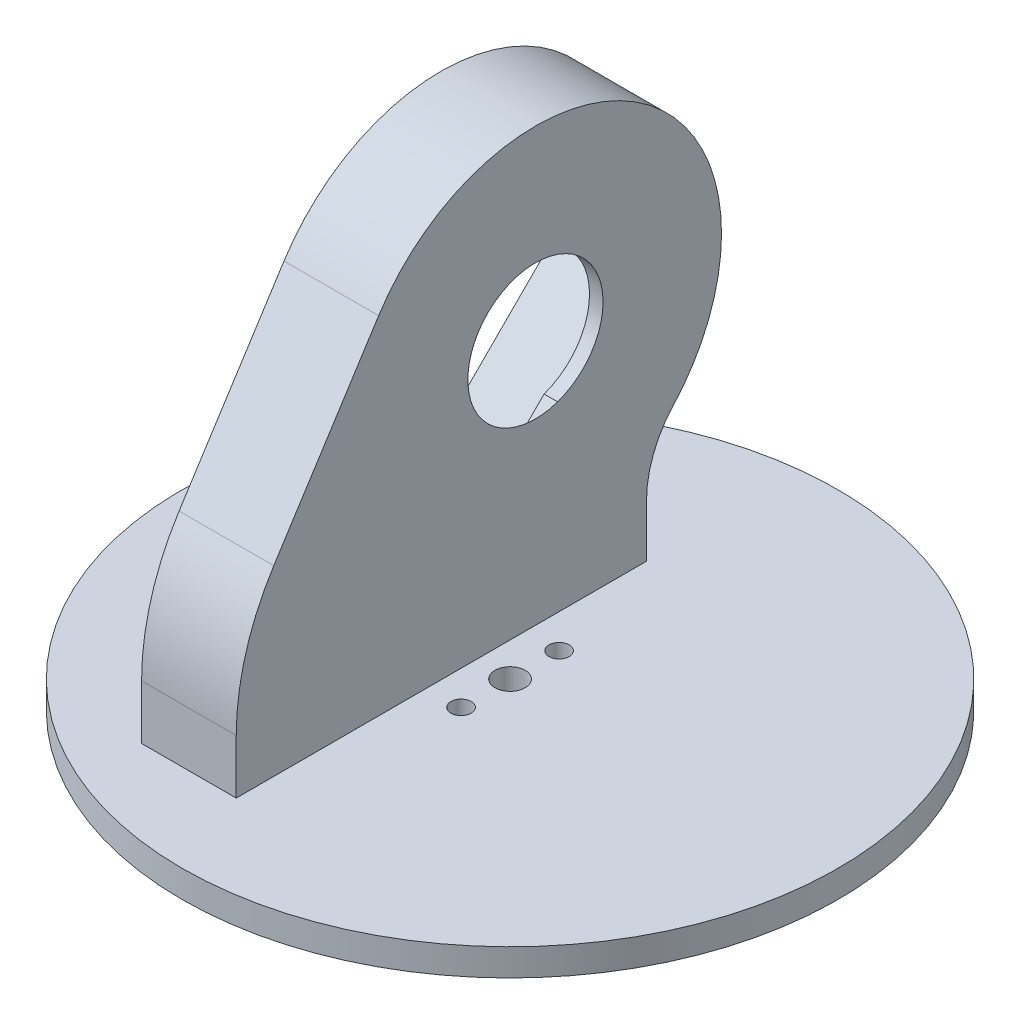
ISO-10303-21;
HEADER;
FILE_DESCRIPTION(('STEP AP214'),'2;1');
FILE_NAME('part.step','',(''),(''),'','','');
FILE_SCHEMA(('AUTOMOTIVE_DESIGN { 1 0 10303 214 1 1 1 1 }'));
ENDSEC;
DATA;
#1=APPLICATION_CONTEXT('core data for automotive mechanical design processes');
#2=APPLICATION_PROTOCOL_DEFINITION('international standard','automotive_design',2000,#1);
#3=PRODUCT_CONTEXT('',#1,'mechanical');
#4=PRODUCT('Part','Part','',(#3));
#5=PRODUCT_RELATED_PRODUCT_CATEGORY('part','',(#4));
#6=PRODUCT_DEFINITION_FORMATION('','',#4);
#7=PRODUCT_DEFINITION_CONTEXT('part definition',#1,'design');
#8=PRODUCT_DEFINITION('design','',#6,#7);
#9=PRODUCT_DEFINITION_SHAPE('','',#8);
#10=(LENGTH_UNIT() NAMED_UNIT(*) SI_UNIT(.MILLI.,.METRE.));
#11=(NAMED_UNIT(*) PLANE_ANGLE_UNIT() SI_UNIT($,.RADIAN.));
#12=(NAMED_UNIT(*) SI_UNIT($,.STERADIAN.) SOLID_ANGLE_UNIT());
#13=UNCERTAINTY_MEASURE_WITH_UNIT(LENGTH_MEASURE(1.E-05),#10,'distance_accuracy_value','');
#14=(GEOMETRIC_REPRESENTATION_CONTEXT(3) GLOBAL_UNCERTAINTY_ASSIGNED_CONTEXT((#13)) GLOBAL_UNIT_ASSIGNED_CONTEXT((#10,
#11,#12)) REPRESENTATION_CONTEXT('',''));
#15=CARTESIAN_POINT('',(0.,0.,0.));
#16=DIRECTION('',(0.,0.,1.));
#17=DIRECTION('',(1.,0.,0.));
#18=AXIS2_PLACEMENT_3D('',#15,#16,#17);
#19=CARTESIAN_POINT('',(-19.,40.4372610697106,-8.74999999999998));
#20=DIRECTION('',(1.,0.,0.));
#21=DIRECTION('',(0.,0.,-1.));
#22=AXIS2_PLACEMENT_3D('',#19,#20,#21);
#23=CYLINDRICAL_SURFACE('',#22,10.);
#24=CARTESIAN_POINT('',(-4.9999,40.4372610697106,-8.74999999999998));
#25=DIRECTION('',(1.,0.,0.));
#26=DIRECTION('',(0.,0.,-1.));
#27=AXIS2_PLACEMENT_3D('',#24,#25,#26);
#28=CIRCLE('',#27,10.);
#29=CARTESIAN_POINT('',(-4.9999,40.4372610697106,-18.75));
#30=VERTEX_POINT('',#29);
#31=EDGE_CURVE('E382',#30,#30,#28,.T.);
#32=ORIENTED_EDGE('',*,*,#31,.T.);
#33=EDGE_LOOP('',(#32));
#34=FACE_BOUND('',#33,.T.);
#35=DIRECTION('',(-1.,0.,0.));
#36=VECTOR('',#35,1.);
#37=CARTESIAN_POINT('',(-5.,43.7190150989049,0.696168032163472));
#38=LINE('',#37,#36);
#39=CARTESIAN_POINT('',(-5.,43.7190150989049,0.696168032163472));
#40=VERTEX_POINT('',#39);
#41=CARTESIAN_POINT('',(-7.,43.7190150989049,0.696168032163472));
#42=VERTEX_POINT('',#41);
#43=EDGE_CURVE('E718',#40,#42,#38,.T.);
#44=ORIENTED_EDGE('',*,*,#43,.T.);
#45=CARTESIAN_POINT('',(-7.,40.4372610697106,-8.74999999999998));
#46=DIRECTION('',(1.,0.,0.));
#47=DIRECTION('',(0.,0.,-1.));
#48=AXIS2_PLACEMENT_3D('',#45,#46,#47);
#49=CIRCLE('',#48,10.);
#50=CARTESIAN_POINT('',(-7.,30.9910930375471,-12.0317540291943));
#51=VERTEX_POINT('',#50);
#52=EDGE_CURVE('E201',#42,#51,#49,.F.);
#53=ORIENTED_EDGE('',*,*,#52,.T.);
#54=DIRECTION('',(-1.,0.,0.));
#55=VECTOR('',#54,1.);
#56=CARTESIAN_POINT('',(-5.,30.9910930375471,-12.0317540291943));
#57=LINE('',#56,#55);
#58=CARTESIAN_POINT('',(-5.,30.9910930375471,-12.0317540291943));
#59=VERTEX_POINT('',#58);
#60=EDGE_CURVE('E63',#59,#51,#57,.T.);
#61=ORIENTED_EDGE('',*,*,#60,.F.);
#62=CARTESIAN_POINT('',(-5.,40.4372610697106,-8.74999999999998));
#63=DIRECTION('',(-1.,0.,0.));
#64=DIRECTION('',(0.,0.,1.));
#65=AXIS2_PLACEMENT_3D('',#62,#63,#64);
#66=CIRCLE('',#65,10.);
#67=EDGE_CURVE('E187',#40,#59,#66,.F.);
#68=ORIENTED_EDGE('',*,*,#67,.F.);
#69=EDGE_LOOP('',(#44,#53,#61,#68));
#70=FACE_BOUND('',#69,.T.);
#71=ADVANCED_FACE('F45',(#34,#70),#23,.F.);
#72=CARTESIAN_POINT('',(-7.,0.,0.));
#73=DIRECTION('',(1.,0.,0.));
#74=DIRECTION('',(0.,0.,-1.));
#75=AXIS2_PLACEMENT_3D('',#72,#73,#74);
#76=PLANE('',#75);
#77=DIRECTION('',(0.,-0.707106781186547,0.707106781186548));
#78=VECTOR('',#77,1.);
#79=CARTESIAN_POINT('',(-7.,11.2691063457655,5.56891231902761));
#80=LINE('',#79,#78);
#81=CARTESIAN_POINT('',(-7.,40.2604843744139,-23.4224657096208));
#82=VERTEX_POINT('',#81);
#83=CARTESIAN_POINT('',(-7.,11.2691063457655,5.56891231902761));
#84=VERTEX_POINT('',#83);
#85=EDGE_CURVE('E543',#82,#84,#80,.T.);
#86=ORIENTED_EDGE('',*,*,#85,.T.);
#87=DIRECTION('',(0.,0.707106781186548,0.707106781186547));
#88=VECTOR('',#87,1.);
#89=CARTESIAN_POINT('',(-7.,11.2691063457655,5.56891231902761));
#90=LINE('',#89,#88);
#91=CARTESIAN_POINT('',(-7.,26.1183487506831,20.4181547239452));
#92=VERTEX_POINT('',#91);
#93=EDGE_CURVE('E558',#84,#92,#90,.T.);
#94=ORIENTED_EDGE('',*,*,#93,.T.);
#95=DIRECTION('',(0.,0.707106781186547,-0.707106781186548));
#96=VECTOR('',#95,1.);
#97=CARTESIAN_POINT('',(-7.,26.1183487506831,20.4181547239452));
#98=LINE('',#97,#96);
#99=CARTESIAN_POINT('',(-7.,55.1097267793315,-8.57322330470323));
#100=VERTEX_POINT('',#99);
#101=EDGE_CURVE('E561',#92,#100,#98,.T.);
#102=ORIENTED_EDGE('',*,*,#101,.T.);
#103=DIRECTION('',(0.,-0.707106781186548,-0.707106781186547));
#104=VECTOR('',#103,1.);
#105=CARTESIAN_POINT('',(-7.,40.2604843744139,-23.4224657096208));
#106=LINE('',#105,#104);
#107=EDGE_CURVE('E399',#100,#82,#106,.T.);
#108=ORIENTED_EDGE('',*,*,#107,.T.);
#109=EDGE_LOOP('',(#86,#94,#102,#108));
#110=FACE_BOUND('',#109,.T.);
#111=DIRECTION('',(0.,-0.707106781186548,0.707106781186548));
#112=VECTOR('',#111,1.);
#113=CARTESIAN_POINT('',(-7.,22.2075915655342,22.2075915655342));
#114=LINE('',#113,#112);
#115=CARTESIAN_POINT('',(-7.,29.1942632488444,15.2209198822239));
#116=VERTEX_POINT('',#115);
#117=EDGE_CURVE('E197',#42,#116,#114,.T.);
#118=ORIENTED_EDGE('',*,*,#117,.T.);
#119=DIRECTION('',(0.,0.707106781186547,0.707106781186548));
#120=VECTOR('',#119,1.);
#121=CARTESIAN_POINT('',(-7.,6.98667168331025,-6.98667168331024));
#122=LINE('',#121,#120);
#123=CARTESIAN_POINT('',(-7.,25.7011557497829,11.7278123831624));
#124=VERTEX_POINT('',#123);
#125=EDGE_CURVE('E709',#124,#116,#122,.T.);
#126=ORIENTED_EDGE('',*,*,#125,.F.);
#127=CARTESIAN_POINT('',(-7.,22.8303022181655,8.85695885154502));
#128=DIRECTION('',(-1.,0.,0.));
#129=DIRECTION('',(0.,0.,1.));
#130=AXIS2_PLACEMENT_3D('',#127,#128,#129);
#131=CIRCLE('',#130,4.06);
#132=CARTESIAN_POINT('',(-7.,19.9594486865481,5.98610531992763));
#133=VERTEX_POINT('',#132);
#134=EDGE_CURVE('E702',#133,#124,#131,.T.);
#135=ORIENTED_EDGE('',*,*,#134,.F.);
#136=DIRECTION('',(0.,0.707106781186547,0.707106781186548));
#137=VECTOR('',#136,1.);
#138=CARTESIAN_POINT('',(-7.,6.98667168331025,-6.98667168331024));
#139=LINE('',#138,#137);
#140=CARTESIAN_POINT('',(-7.,16.4663411874866,2.49299782086615));
#141=VERTEX_POINT('',#140);
#142=EDGE_CURVE('E698',#141,#133,#139,.T.);
#143=ORIENTED_EDGE('',*,*,#142,.F.);
#144=DIRECTION('',(0.,-0.707106781186548,0.707106781186547));
#145=VECTOR('',#144,1.);
#146=CARTESIAN_POINT('',(-7.,9.47966950417638,9.4796695041764));
#147=LINE('',#146,#145);
#148=EDGE_CURVE('E703',#51,#141,#147,.T.);
#149=ORIENTED_EDGE('',*,*,#148,.F.);
#150=ORIENTED_EDGE('',*,*,#52,.F.);
#151=EDGE_LOOP('',(#118,#126,#135,#143,#149,#150));
#152=FACE_BOUND('',#151,.T.);
#153=ADVANCED_FACE('F264',(#110,#152),#76,.F.);
#154=CARTESIAN_POINT('',(0.,4.,0.));
#155=DIRECTION('',(0.,1.,0.));
#156=DIRECTION('',(0.,0.,1.));
#157=AXIS2_PLACEMENT_3D('',#154,#155,#156);
#158=PLANE('',#157);
#159=CARTESIAN_POINT('',(0.,4.,7.25));
#160=DIRECTION('',(0.,1.,0.));
#161=DIRECTION('',(0.,0.,1.));
#162=AXIS2_PLACEMENT_3D('',#159,#160,#161);
#163=CIRCLE('',#162,1.5);
#164=CARTESIAN_POINT('',(0.,4.,8.75));
#165=VERTEX_POINT('',#164);
#166=EDGE_CURVE('E368',#165,#165,#163,.T.);
#167=ORIENTED_EDGE('',*,*,#166,.F.);
#168=EDGE_LOOP('',(#167));
#169=FACE_BOUND('',#168,.T.);
#170=CARTESIAN_POINT('',(0.,4.,0.));
#171=DIRECTION('',(0.,1.,0.));
#172=DIRECTION('',(0.,0.,1.));
#173=AXIS2_PLACEMENT_3D('',#170,#171,#172);
#174=CIRCLE('',#173,48.5);
#175=CARTESIAN_POINT('',(0.,4.,48.5));
#176=VERTEX_POINT('',#175);
#177=EDGE_CURVE('E11',#176,#176,#174,.T.);
#178=ORIENTED_EDGE('',*,*,#177,.T.);
#179=EDGE_LOOP('',(#178));
#180=FACE_BOUND('',#179,.T.);
#181=CARTESIAN_POINT('',(0.,4.,-7.25));
#182=DIRECTION('',(0.,1.,0.));
#183=DIRECTION('',(0.,0.,1.));
#184=AXIS2_PLACEMENT_3D('',#181,#182,#183);
#185=CIRCLE('',#184,1.5);
#186=CARTESIAN_POINT('',(0.,4.,-5.75));
#187=VERTEX_POINT('',#186);
#188=EDGE_CURVE('E374',#187,#187,#185,.T.);
#189=ORIENTED_EDGE('',*,*,#188,.F.);
#190=EDGE_LOOP('',(#189));
#191=FACE_BOUND('',#190,.T.);
#192=CARTESIAN_POINT('',(0.,4.,0.));
#193=DIRECTION('',(0.,1.,0.));
#194=DIRECTION('',(0.,0.,1.));
#195=AXIS2_PLACEMENT_3D('',#192,#193,#194);
#196=CIRCLE('',#195,2.23559103478263);
#197=CARTESIAN_POINT('',(0.,4.,2.23559103478263));
#198=VERTEX_POINT('',#197);
#199=EDGE_CURVE('E357',#198,#198,#196,.T.);
#200=ORIENTED_EDGE('',*,*,#199,.F.);
#201=EDGE_LOOP('',(#200));
#202=FACE_BOUND('',#201,.T.);
#203=DIRECTION('',(0.,0.,-1.));
#204=VECTOR('',#203,1.);
#205=CARTESIAN_POINT('',(-19.,4.,-25.18));
#206=LINE('',#205,#204);
#207=CARTESIAN_POINT('',(-19.,3.99999999999999,35.5));
#208=VERTEX_POINT('',#207);
#209=CARTESIAN_POINT('',(-19.,3.99999999999999,28.7375200818037));
#210=VERTEX_POINT('',#209);
#211=EDGE_CURVE('E440',#208,#210,#206,.T.);
#212=ORIENTED_EDGE('',*,*,#211,.T.);
#213=DIRECTION('',(-1.,0.,0.));
#214=VECTOR('',#213,1.);
#215=CARTESIAN_POINT('',(-17.,3.99999999999999,28.7375200818037));
#216=LINE('',#215,#214);
#217=CARTESIAN_POINT('',(-17.,3.99999999999999,28.7375200818037));
#218=VERTEX_POINT('',#217);
#219=EDGE_CURVE('E499',#218,#210,#216,.T.);
#220=ORIENTED_EDGE('',*,*,#219,.F.);
#221=DIRECTION('',(0.,0.,1.));
#222=VECTOR('',#221,1.);
#223=CARTESIAN_POINT('',(-17.,4.,-16.8750750838362));
#224=LINE('',#223,#222);
#225=CARTESIAN_POINT('',(-17.,4.,-16.8750750838362));
#226=VERTEX_POINT('',#225);
#227=EDGE_CURVE('E219',#226,#218,#224,.T.);
#228=ORIENTED_EDGE('',*,*,#227,.F.);
#229=DIRECTION('',(-1.,0.,0.));
#230=VECTOR('',#229,1.);
#231=CARTESIAN_POINT('',(-17.,4.,-16.8750750838362));
#232=LINE('',#231,#230);
#233=CARTESIAN_POINT('',(-19.,4.,-16.8750750838362));
#234=VERTEX_POINT('',#233);
#235=EDGE_CURVE('E503',#226,#234,#232,.T.);
#236=ORIENTED_EDGE('',*,*,#235,.T.);
#237=CARTESIAN_POINT('',(-19.,4.,-25.18));
#238=VERTEX_POINT('',#237);
#239=EDGE_CURVE('E439',#234,#238,#206,.T.);
#240=ORIENTED_EDGE('',*,*,#239,.T.);
#241=DIRECTION('',(1.,0.,0.));
#242=VECTOR('',#241,1.);
#243=CARTESIAN_POINT('',(-19.,4.,-25.18));
#244=LINE('',#243,#242);
#245=CARTESIAN_POINT('',(-4.9999,4.,-25.18));
#246=VERTEX_POINT('',#245);
#247=EDGE_CURVE('E476',#238,#246,#244,.T.);
#248=ORIENTED_EDGE('',*,*,#247,.T.);
#249=DIRECTION('',(0.,0.,-1.));
#250=VECTOR('',#249,1.);
#251=CARTESIAN_POINT('',(-4.9999,4.,-25.18));
#252=LINE('',#251,#250);
#253=CARTESIAN_POINT('',(-4.9999,3.99999999999999,35.5));
#254=VERTEX_POINT('',#253);
#255=EDGE_CURVE('E412',#254,#246,#252,.T.);
#256=ORIENTED_EDGE('',*,*,#255,.F.);
#257=DIRECTION('',(1.,0.,0.));
#258=VECTOR('',#257,1.);
#259=CARTESIAN_POINT('',(-19.,3.99999999999999,35.5));
#260=LINE('',#259,#258);
#261=EDGE_CURVE('E463',#208,#254,#260,.T.);
#262=ORIENTED_EDGE('',*,*,#261,.F.);
#263=EDGE_LOOP('',(#212,#220,#228,#236,#240,#248,#256,#262));
#264=FACE_BOUND('',#263,.T.);
#265=ADVANCED_FACE('F267',(#169,#180,#191,#202,#264),#158,.T.);
#266=CARTESIAN_POINT('',(0.,0.,0.));
#267=DIRECTION('',(0.,1.,0.));
#268=DIRECTION('',(0.,0.,1.));
#269=AXIS2_PLACEMENT_3D('',#266,#267,#268);
#270=PLANE('',#269);
#271=CARTESIAN_POINT('',(0.,0.,0.));
#272=DIRECTION('',(0.,1.,0.));
#273=DIRECTION('',(0.,0.,1.));
#274=AXIS2_PLACEMENT_3D('',#271,#272,#273);
#275=CIRCLE('',#274,48.5);
#276=CARTESIAN_POINT('',(0.,0.,48.5));
#277=VERTEX_POINT('',#276);
#278=EDGE_CURVE('E55',#277,#277,#275,.T.);
#279=ORIENTED_EDGE('',*,*,#278,.F.);
#280=EDGE_LOOP('',(#279));
#281=FACE_BOUND('',#280,.T.);
#282=CARTESIAN_POINT('',(0.,0.,-7.25));
#283=DIRECTION('',(0.,1.,0.));
#284=DIRECTION('',(0.,0.,1.));
#285=AXIS2_PLACEMENT_3D('',#282,#283,#284);
#286=CIRCLE('',#285,1.5);
#287=CARTESIAN_POINT('',(0.,0.,-5.75));
#288=VERTEX_POINT('',#287);
#289=EDGE_CURVE('E347',#288,#288,#286,.T.);
#290=ORIENTED_EDGE('',*,*,#289,.T.);
#291=EDGE_LOOP('',(#290));
#292=FACE_BOUND('',#291,.T.);
#293=CARTESIAN_POINT('',(0.,0.,7.25));
#294=DIRECTION('',(0.,1.,0.));
#295=DIRECTION('',(0.,0.,1.));
#296=AXIS2_PLACEMENT_3D('',#293,#294,#295);
#297=CIRCLE('',#296,1.5);
#298=CARTESIAN_POINT('',(0.,0.,8.75));
#299=VERTEX_POINT('',#298);
#300=EDGE_CURVE('E351',#299,#299,#297,.T.);
#301=ORIENTED_EDGE('',*,*,#300,.T.);
#302=EDGE_LOOP('',(#301));
#303=FACE_BOUND('',#302,.T.);
#304=CARTESIAN_POINT('',(0.,0.,0.));
#305=DIRECTION('',(0.,1.,0.));
#306=DIRECTION('',(0.,0.,1.));
#307=AXIS2_PLACEMENT_3D('',#304,#305,#306);
#308=CIRCLE('',#307,2.23559103478263);
#309=CARTESIAN_POINT('',(0.,0.,2.23559103478263));
#310=VERTEX_POINT('',#309);
#311=EDGE_CURVE('E354',#310,#310,#308,.T.);
#312=ORIENTED_EDGE('',*,*,#311,.T.);
#313=EDGE_LOOP('',(#312));
#314=FACE_BOUND('',#313,.T.);
#315=ADVANCED_FACE('F333',(#281,#292,#303,#314),#270,.F.);
#316=CARTESIAN_POINT('',(0.,4.,0.));
#317=DIRECTION('',(0.,-1.,0.));
#318=DIRECTION('',(0.,0.,-1.));
#319=AXIS2_PLACEMENT_3D('',#316,#317,#318);
#320=CYLINDRICAL_SURFACE('',#319,48.5);
#321=ORIENTED_EDGE('',*,*,#177,.F.);
#322=EDGE_LOOP('',(#321));
#323=FACE_BOUND('',#322,.T.);
#324=ORIENTED_EDGE('',*,*,#278,.T.);
#325=EDGE_LOOP('',(#324));
#326=FACE_BOUND('',#325,.T.);
#327=ADVANCED_FACE('F47',(#323,#326),#320,.T.);
#328=CARTESIAN_POINT('',(0.,4.,-7.25));
#329=DIRECTION('',(0.,-1.,0.));
#330=DIRECTION('',(0.,0.,-1.));
#331=AXIS2_PLACEMENT_3D('',#328,#329,#330);
#332=CYLINDRICAL_SURFACE('',#331,1.5);
#333=ORIENTED_EDGE('',*,*,#188,.T.);
#334=EDGE_LOOP('',(#333));
#335=FACE_BOUND('',#334,.T.);
#336=ORIENTED_EDGE('',*,*,#289,.F.);
#337=EDGE_LOOP('',(#336));
#338=FACE_BOUND('',#337,.T.);
#339=ADVANCED_FACE('F327',(#335,#338),#332,.F.);
#340=CARTESIAN_POINT('',(0.,4.,7.25));
#341=DIRECTION('',(0.,-1.,0.));
#342=DIRECTION('',(0.,0.,-1.));
#343=AXIS2_PLACEMENT_3D('',#340,#341,#342);
#344=CYLINDRICAL_SURFACE('',#343,1.5);
#345=ORIENTED_EDGE('',*,*,#166,.T.);
#346=EDGE_LOOP('',(#345));
#347=FACE_BOUND('',#346,.T.);
#348=ORIENTED_EDGE('',*,*,#300,.F.);
#349=EDGE_LOOP('',(#348));
#350=FACE_BOUND('',#349,.T.);
#351=ADVANCED_FACE('F323',(#347,#350),#344,.F.);
#352=CARTESIAN_POINT('',(0.,4.,0.));
#353=DIRECTION('',(0.,-1.,0.));
#354=DIRECTION('',(0.,0.,-1.));
#355=AXIS2_PLACEMENT_3D('',#352,#353,#354);
#356=CYLINDRICAL_SURFACE('',#355,2.23559103478263);
#357=ORIENTED_EDGE('',*,*,#199,.T.);
#358=EDGE_LOOP('',(#357));
#359=FACE_BOUND('',#358,.T.);
#360=ORIENTED_EDGE('',*,*,#311,.F.);
#361=EDGE_LOOP('',(#360));
#362=FACE_BOUND('',#361,.T.);
#363=ADVANCED_FACE('F319',(#359,#362),#356,.F.);
#364=CARTESIAN_POINT('',(-19.,3.99999999999999,35.5));
#365=DIRECTION('',(0.,0.,1.));
#366=DIRECTION('',(1.,0.,0.));
#367=AXIS2_PLACEMENT_3D('',#364,#365,#366);
#368=PLANE('',#367);
#369=ORIENTED_EDGE('',*,*,#261,.T.);
#370=DIRECTION('',(0.,-1.,0.));
#371=VECTOR('',#370,1.);
#372=CARTESIAN_POINT('',(-4.9999,3.99999999999999,35.5));
#373=LINE('',#372,#371);
#374=CARTESIAN_POINT('',(-4.9999,12.0172610697105,35.5));
#375=VERTEX_POINT('',#374);
#376=EDGE_CURVE('E387',#375,#254,#373,.T.);
#377=ORIENTED_EDGE('',*,*,#376,.F.);
#378=DIRECTION('',(1.,0.,0.));
#379=VECTOR('',#378,1.);
#380=CARTESIAN_POINT('',(-19.,12.0172610697105,35.5));
#381=LINE('',#380,#379);
#382=CARTESIAN_POINT('',(-19.,12.0172610697105,35.5));
#383=VERTEX_POINT('',#382);
#384=EDGE_CURVE('E358',#383,#375,#381,.T.);
#385=ORIENTED_EDGE('',*,*,#384,.F.);
#386=DIRECTION('',(0.,-1.,0.));
#387=VECTOR('',#386,1.);
#388=CARTESIAN_POINT('',(-19.,3.99999999999999,35.5));
#389=LINE('',#388,#387);
#390=EDGE_CURVE('E435',#383,#208,#389,.T.);
#391=ORIENTED_EDGE('',*,*,#390,.T.);
#392=EDGE_LOOP('',(#369,#377,#385,#391));
#393=FACE_BOUND('',#392,.T.);
#394=ADVANCED_FACE('F301',(#393),#368,.T.);
#395=CARTESIAN_POINT('',(-19.,12.0172610697105,0.27000000000001));
#396=DIRECTION('',(1.,0.,0.));
#397=DIRECTION('',(0.,0.,-1.));
#398=AXIS2_PLACEMENT_3D('',#395,#396,#397);
#399=CYLINDRICAL_SURFACE('',#398,35.23);
#400=ORIENTED_EDGE('',*,*,#384,.T.);
#401=CARTESIAN_POINT('',(-4.9999,12.0172610697105,0.27000000000001));
#402=DIRECTION('',(1.,0.,0.));
#403=DIRECTION('',(0.,0.,1.));
#404=AXIS2_PLACEMENT_3D('',#401,#402,#403);
#405=CIRCLE('',#404,35.23);
#406=CARTESIAN_POINT('',(-4.9999,30.9933747980184,29.9526549986743));
#407=VERTEX_POINT('',#406);
#408=EDGE_CURVE('E431',#407,#375,#405,.T.);
#409=ORIENTED_EDGE('',*,*,#408,.F.);
#410=DIRECTION('',(1.,0.,0.));
#411=VECTOR('',#410,1.);
#412=CARTESIAN_POINT('',(-19.,30.9933747980184,29.9526549986743));
#413=LINE('',#412,#411);
#414=CARTESIAN_POINT('',(-19.,30.9933747980184,29.9526549986743));
#415=VERTEX_POINT('',#414);
#416=EDGE_CURVE('E364',#415,#407,#413,.T.);
#417=ORIENTED_EDGE('',*,*,#416,.F.);
#418=CARTESIAN_POINT('',(-19.,12.0172610697105,0.27000000000001));
#419=DIRECTION('',(1.,0.,0.));
#420=DIRECTION('',(0.,0.,1.));
#421=AXIS2_PLACEMENT_3D('',#418,#419,#420);
#422=CIRCLE('',#421,35.23);
#423=EDGE_CURVE('E460',#415,#383,#422,.T.);
#424=ORIENTED_EDGE('',*,*,#423,.T.);
#425=EDGE_LOOP('',(#400,#409,#417,#424));
#426=FACE_BOUND('',#425,.T.);
#427=ADVANCED_FACE('F297',(#426),#399,.T.);
#428=CARTESIAN_POINT('',(-19.,30.9933747980184,29.9526549986743));
#429=DIRECTION('',(0.,0.538635076023498,0.842539171123314));
#430=DIRECTION('',(0.,-0.842539171123314,0.538635076023498));
#431=AXIS2_PLACEMENT_3D('',#428,#429,#430);
#432=PLANE('',#431);
#433=ORIENTED_EDGE('',*,*,#416,.T.);
#434=DIRECTION('',(0.,-0.842539171123314,0.538635076023498));
#435=VECTOR('',#434,1.);
#436=CARTESIAN_POINT('',(-4.9999,30.9933747980184,29.9526549986743));
#437=LINE('',#436,#435);
#438=CARTESIAN_POINT('',(-4.9999,55.2614110590541,14.4381056407183));
#439=VERTEX_POINT('',#438);
#440=EDGE_CURVE('E427',#439,#407,#437,.T.);
#441=ORIENTED_EDGE('',*,*,#440,.F.);
#442=DIRECTION('',(1.,0.,0.));
#443=VECTOR('',#442,1.);
#444=CARTESIAN_POINT('',(-19.,55.2614110590541,14.4381056407183));
#445=LINE('',#444,#443);
#446=CARTESIAN_POINT('',(-19.,55.2614110590541,14.4381056407183));
#447=VERTEX_POINT('',#446);
#448=EDGE_CURVE('E467',#447,#439,#445,.T.);
#449=ORIENTED_EDGE('',*,*,#448,.F.);
#450=DIRECTION('',(0.,-0.842539171123314,0.538635076023498));
#451=VECTOR('',#450,1.);
#452=CARTESIAN_POINT('',(-19.,30.9933747980184,29.9526549986743));
#453=LINE('',#452,#451);
#454=EDGE_CURVE('E456',#447,#415,#453,.T.);
#455=ORIENTED_EDGE('',*,*,#454,.T.);
#456=EDGE_LOOP('',(#433,#441,#449,#455));
#457=FACE_BOUND('',#456,.T.);
#458=ADVANCED_FACE('F300',(#457),#432,.T.);
#459=CARTESIAN_POINT('',(-19.,40.4372610697106,-8.74999999999998));
#460=DIRECTION('',(1.,0.,0.));
#461=DIRECTION('',(0.,0.,-1.));
#462=AXIS2_PLACEMENT_3D('',#459,#460,#461);
#463=CYLINDRICAL_SURFACE('',#462,27.5216944629444);
#464=ORIENTED_EDGE('',*,*,#448,.T.);
#465=CARTESIAN_POINT('',(-4.9999,40.4372610697106,-8.74999999999998));
#466=DIRECTION('',(1.,0.,0.));
#467=DIRECTION('',(0.,0.,-1.));
#468=AXIS2_PLACEMENT_3D('',#465,#466,#467);
#469=CIRCLE('',#468,27.5216944629444);
#470=CARTESIAN_POINT('',(-4.9999,21.9003391672773,-29.0927184145767));
#471=VERTEX_POINT('',#470);
#472=EDGE_CURVE('E423',#471,#439,#469,.T.);
#473=ORIENTED_EDGE('',*,*,#472,.F.);
#474=DIRECTION('',(1.,0.,0.));
#475=VECTOR('',#474,1.);
#476=CARTESIAN_POINT('',(-19.,21.9003391672773,-29.0927184145767));
#477=LINE('',#476,#475);
#478=CARTESIAN_POINT('',(-19.,21.9003391672773,-29.0927184145767));
#479=VERTEX_POINT('',#478);
#480=EDGE_CURVE('E470',#479,#471,#477,.T.);
#481=ORIENTED_EDGE('',*,*,#480,.F.);
#482=CARTESIAN_POINT('',(-19.,40.4372610697106,-8.74999999999998));
#483=DIRECTION('',(1.,0.,0.));
#484=DIRECTION('',(0.,0.,-1.));
#485=AXIS2_PLACEMENT_3D('',#482,#483,#484);
#486=CIRCLE('',#485,27.5216944629444);
#487=EDGE_CURVE('E452',#479,#447,#486,.T.);
#488=ORIENTED_EDGE('',*,*,#487,.T.);
#489=EDGE_LOOP('',(#464,#473,#481,#488));
#490=FACE_BOUND('',#489,.T.);
#491=ADVANCED_FACE('F305',(#490),#463,.T.);
#492=CARTESIAN_POINT('',(-19.,11.7972610697105,-40.18));
#493=DIRECTION('',(1.,0.,0.));
#494=DIRECTION('',(0.,0.,-1.));
#495=AXIS2_PLACEMENT_3D('',#492,#493,#494);
#496=CYLINDRICAL_SURFACE('',#495,15.);
#497=ORIENTED_EDGE('',*,*,#480,.T.);
#498=CARTESIAN_POINT('',(-4.9999,11.7972610697105,-40.18));
#499=DIRECTION('',(-1.,0.,0.));
#500=DIRECTION('',(0.,0.,1.));
#501=AXIS2_PLACEMENT_3D('',#498,#499,#500);
#502=CIRCLE('',#501,15.);
#503=CARTESIAN_POINT('',(-4.9999,11.7972610697105,-25.18));
#504=VERTEX_POINT('',#503);
#505=EDGE_CURVE('E419',#504,#471,#502,.T.);
#506=ORIENTED_EDGE('',*,*,#505,.F.);
#507=DIRECTION('',(1.,0.,0.));
#508=VECTOR('',#507,1.);
#509=CARTESIAN_POINT('',(-19.,11.7972610697105,-25.18));
#510=LINE('',#509,#508);
#511=CARTESIAN_POINT('',(-19.,11.7972610697105,-25.18));
#512=VERTEX_POINT('',#511);
#513=EDGE_CURVE('E473',#512,#504,#510,.T.);
#514=ORIENTED_EDGE('',*,*,#513,.F.);
#515=CARTESIAN_POINT('',(-19.,11.7972610697105,-40.18));
#516=DIRECTION('',(-1.,0.,0.));
#517=DIRECTION('',(0.,0.,1.));
#518=AXIS2_PLACEMENT_3D('',#515,#516,#517);
#519=CIRCLE('',#518,15.);
#520=EDGE_CURVE('E448',#512,#479,#519,.T.);
#521=ORIENTED_EDGE('',*,*,#520,.T.);
#522=EDGE_LOOP('',(#497,#506,#514,#521));
#523=FACE_BOUND('',#522,.T.);
#524=ADVANCED_FACE('F309',(#523),#496,.F.);
#525=CARTESIAN_POINT('',(-19.,4.,-25.18));
#526=DIRECTION('',(0.,0.,-1.));
#527=DIRECTION('',(0.,1.,0.));
#528=AXIS2_PLACEMENT_3D('',#525,#526,#527);
#529=PLANE('',#528);
#530=ORIENTED_EDGE('',*,*,#513,.T.);
#531=DIRECTION('',(0.,1.,0.));
#532=VECTOR('',#531,1.);
#533=CARTESIAN_POINT('',(-4.9999,4.,-25.18));
#534=LINE('',#533,#532);
#535=EDGE_CURVE('E415',#246,#504,#534,.T.);
#536=ORIENTED_EDGE('',*,*,#535,.F.);
#537=ORIENTED_EDGE('',*,*,#247,.F.);
#538=DIRECTION('',(0.,1.,0.));
#539=VECTOR('',#538,1.);
#540=CARTESIAN_POINT('',(-19.,4.,-25.18));
#541=LINE('',#540,#539);
#542=EDGE_CURVE('E444',#238,#512,#541,.T.);
#543=ORIENTED_EDGE('',*,*,#542,.T.);
#544=EDGE_LOOP('',(#530,#536,#537,#543));
#545=FACE_BOUND('',#544,.T.);
#546=ADVANCED_FACE('F295',(#545),#529,.T.);
#547=CARTESIAN_POINT('',(-19.,12.0172610697105,0.27000000000001));
#548=DIRECTION('',(-1.,0.,0.));
#549=DIRECTION('',(0.,0.,1.));
#550=AXIS2_PLACEMENT_3D('',#547,#548,#549);
#551=PLANE('',#550);
#552=CARTESIAN_POINT('',(-19.,3.99999999999999,28.7375200818037));
#553=CARTESIAN_POINT('',(-19.,21.2545024831634,37.0291371039701));
#554=CARTESIAN_POINT('',(-19.,35.8056301343027,20.7156646877117));
#555=CARTESIAN_POINT('',(-19.,62.5246260346781,7.98292021014286));
#556=CARTESIAN_POINT('',(-19.,67.5550572258926,-17.215111481128));
#557=CARTESIAN_POINT('',(-19.,51.0006915540233,-33.9330007459491));
#558=CARTESIAN_POINT('',(-19.,25.1592889935179,-34.1249774953416));
#559=CARTESIAN_POINT('',(-19.,15.1600771354971,-17.7370132718971));
#560=CARTESIAN_POINT('',(-19.,4.,-16.8750750838362));
#561=B_SPLINE_CURVE_WITH_KNOTS('',3,(#552,#553,#554,#555,#556,#557,#558,#559,#560),
.UNSPECIFIED.,.F.,.F.,(4,1,1,1,1,1,4),(0.,0.274819708359374,0.39908060303322,0.551802707029784,
0.683337610207841,0.800852802192563,1.),.UNSPECIFIED.);
#562=EDGE_CURVE('E71',#210,#234,#561,.T.);
#563=ORIENTED_EDGE('',*,*,#562,.F.);
#564=ORIENTED_EDGE('',*,*,#211,.F.);
#565=ORIENTED_EDGE('',*,*,#390,.F.);
#566=ORIENTED_EDGE('',*,*,#423,.F.);
#567=ORIENTED_EDGE('',*,*,#454,.F.);
#568=ORIENTED_EDGE('',*,*,#487,.F.);
#569=ORIENTED_EDGE('',*,*,#520,.F.);
#570=ORIENTED_EDGE('',*,*,#542,.F.);
#571=ORIENTED_EDGE('',*,*,#239,.F.);
#572=EDGE_LOOP('',(#563,#564,#565,#566,#567,#568,#569,#570,#571));
#573=FACE_BOUND('',#572,.T.);
#574=ADVANCED_FACE('F288',(#573),#551,.T.);
#575=CARTESIAN_POINT('',(-4.9999,12.0172610697105,0.27000000000001));
#576=DIRECTION('',(-1.,0.,0.));
#577=DIRECTION('',(0.,0.,1.));
#578=AXIS2_PLACEMENT_3D('',#575,#576,#577);
#579=PLANE('',#578);
#580=ORIENTED_EDGE('',*,*,#376,.T.);
#581=ORIENTED_EDGE('',*,*,#255,.T.);
#582=ORIENTED_EDGE('',*,*,#535,.T.);
#583=ORIENTED_EDGE('',*,*,#505,.T.);
#584=ORIENTED_EDGE('',*,*,#472,.T.);
#585=ORIENTED_EDGE('',*,*,#440,.T.);
#586=ORIENTED_EDGE('',*,*,#408,.T.);
#587=EDGE_LOOP('',(#580,#581,#582,#583,#584,#585,#586));
#588=FACE_BOUND('',#587,.T.);
#589=ORIENTED_EDGE('',*,*,#31,.F.);
#590=EDGE_LOOP('',(#589));
#591=FACE_BOUND('',#590,.T.);
#592=ADVANCED_FACE('F284',(#588,#591),#579,.F.);
#593=CARTESIAN_POINT('',(-7.,11.2691063457655,5.56891231902761));
#594=DIRECTION('',(0.,-0.707106781186548,-0.707106781186547));
#595=DIRECTION('',(0.,0.707106781186547,-0.707106781186548));
#596=AXIS2_PLACEMENT_3D('',#593,#594,#595);
#597=PLANE('',#596);
#598=DIRECTION('',(-1.,0.,0.));
#599=VECTOR('',#598,1.);
#600=CARTESIAN_POINT('',(-7.,40.2604843744139,-23.4224657096208));
#601=LINE('',#600,#599);
#602=CARTESIAN_POINT('',(-17.,40.2604843744139,-23.4224657096208));
#603=VERTEX_POINT('',#602);
#604=EDGE_CURVE('E383',#82,#603,#601,.T.);
#605=ORIENTED_EDGE('',*,*,#604,.T.);
#606=DIRECTION('',(0.,-0.707106781186547,0.707106781186548));
#607=VECTOR('',#606,1.);
#608=CARTESIAN_POINT('',(-17.,11.2691063457655,5.56891231902761));
#609=LINE('',#608,#607);
#610=CARTESIAN_POINT('',(-17.,11.2691063457655,5.56891231902761));
#611=VERTEX_POINT('',#610);
#612=EDGE_CURVE('E535',#603,#611,#609,.T.);
#613=ORIENTED_EDGE('',*,*,#612,.T.);
#614=DIRECTION('',(-1.,0.,0.));
#615=VECTOR('',#614,1.);
#616=CARTESIAN_POINT('',(-7.,11.2691063457655,5.56891231902761));
#617=LINE('',#616,#615);
#618=EDGE_CURVE('E405',#84,#611,#617,.T.);
#619=ORIENTED_EDGE('',*,*,#618,.F.);
#620=ORIENTED_EDGE('',*,*,#85,.F.);
#621=EDGE_LOOP('',(#605,#613,#619,#620));
#622=FACE_BOUND('',#621,.T.);
#623=ADVANCED_FACE('F273',(#622),#597,.F.);
#624=CARTESIAN_POINT('',(-7.,40.2604843744139,-23.4224657096208));
#625=DIRECTION('',(0.,0.707106781186547,-0.707106781186548));
#626=DIRECTION('',(0.,0.707106781186548,0.707106781186547));
#627=AXIS2_PLACEMENT_3D('',#624,#625,#626);
#628=PLANE('',#627);
#629=DIRECTION('',(-1.,0.,0.));
#630=VECTOR('',#629,1.);
#631=CARTESIAN_POINT('',(-7.,55.1097267793315,-8.57322330470323));
#632=LINE('',#631,#630);
#633=CARTESIAN_POINT('',(-17.,55.1097267793315,-8.57322330470323));
#634=VERTEX_POINT('',#633);
#635=EDGE_CURVE('E390',#100,#634,#632,.T.);
#636=ORIENTED_EDGE('',*,*,#635,.T.);
#637=DIRECTION('',(0.,-0.707106781186548,-0.707106781186547));
#638=VECTOR('',#637,1.);
#639=CARTESIAN_POINT('',(-17.,40.2604843744139,-23.4224657096208));
#640=LINE('',#639,#638);
#641=EDGE_CURVE('E531',#634,#603,#640,.T.);
#642=ORIENTED_EDGE('',*,*,#641,.T.);
#643=ORIENTED_EDGE('',*,*,#604,.F.);
#644=ORIENTED_EDGE('',*,*,#107,.F.);
#645=EDGE_LOOP('',(#636,#642,#643,#644));
#646=FACE_BOUND('',#645,.T.);
#647=ADVANCED_FACE('F269',(#646),#628,.F.);
#648=CARTESIAN_POINT('',(-7.,26.1183487506831,20.4181547239452));
#649=DIRECTION('',(0.,0.707106781186548,0.707106781186547));
#650=DIRECTION('',(0.,-0.707106781186547,0.707106781186548));
#651=AXIS2_PLACEMENT_3D('',#648,#649,#650);
#652=PLANE('',#651);
#653=DIRECTION('',(-1.,0.,0.));
#654=VECTOR('',#653,1.);
#655=CARTESIAN_POINT('',(-7.,26.1183487506831,20.4181547239452));
#656=LINE('',#655,#654);
#657=CARTESIAN_POINT('',(-17.,26.1183487506831,20.4181547239452));
#658=VERTEX_POINT('',#657);
#659=EDGE_CURVE('E396',#92,#658,#656,.T.);
#660=ORIENTED_EDGE('',*,*,#659,.T.);
#661=DIRECTION('',(0.,0.707106781186547,-0.707106781186548));
#662=VECTOR('',#661,1.);
#663=CARTESIAN_POINT('',(-17.,26.1183487506831,20.4181547239452));
#664=LINE('',#663,#662);
#665=EDGE_CURVE('E527',#658,#634,#664,.T.);
#666=ORIENTED_EDGE('',*,*,#665,.T.);
#667=ORIENTED_EDGE('',*,*,#635,.F.);
#668=ORIENTED_EDGE('',*,*,#101,.F.);
#669=EDGE_LOOP('',(#660,#666,#667,#668));
#670=FACE_BOUND('',#669,.T.);
#671=ADVANCED_FACE('F272',(#670),#652,.F.);
#672=CARTESIAN_POINT('',(-7.,11.2691063457655,5.56891231902761));
#673=DIRECTION('',(0.,-0.707106781186547,0.707106781186548));
#674=DIRECTION('',(0.,-0.707106781186548,-0.707106781186547));
#675=AXIS2_PLACEMENT_3D('',#672,#673,#674);
#676=PLANE('',#675);
#677=ORIENTED_EDGE('',*,*,#618,.T.);
#678=DIRECTION('',(0.,0.707106781186548,0.707106781186547));
#679=VECTOR('',#678,1.);
#680=CARTESIAN_POINT('',(-17.,11.2691063457655,5.56891231902761));
#681=LINE('',#680,#679);
#682=EDGE_CURVE('E523',#611,#658,#681,.T.);
#683=ORIENTED_EDGE('',*,*,#682,.T.);
#684=ORIENTED_EDGE('',*,*,#659,.F.);
#685=ORIENTED_EDGE('',*,*,#93,.F.);
#686=EDGE_LOOP('',(#677,#683,#684,#685));
#687=FACE_BOUND('',#686,.T.);
#688=ADVANCED_FACE('F277',(#687),#676,.F.);
#689=CARTESIAN_POINT('',(-17.,64.5165403508952,-8.58781550164776));
#690=DIRECTION('',(1.,0.,0.));
#691=DIRECTION('',(0.,0.,-1.));
#692=AXIS2_PLACEMENT_3D('',#689,#690,#691);
#693=PLANE('',#692);
#694=CARTESIAN_POINT('',(-17.,12.4711878737822,12.1450053840618));
#695=DIRECTION('',(1.,0.,0.));
#696=DIRECTION('',(0.,0.,-1.));
#697=AXIS2_PLACEMENT_3D('',#694,#695,#696);
#698=CIRCLE('',#697,1.30000000000001);
#699=CARTESIAN_POINT('',(-17.,12.4711878737822,10.8450053840617));
#700=VERTEX_POINT('',#699);
#701=EDGE_CURVE('E515',#700,#700,#698,.F.);
#702=ORIENTED_EDGE('',*,*,#701,.F.);
#703=EDGE_LOOP('',(#702));
#704=FACE_BOUND('',#703,.T.);
#705=CARTESIAN_POINT('',(-17.,53.9076452513146,-15.149316369738));
#706=DIRECTION('',(1.,0.,0.));
#707=DIRECTION('',(0.,0.,-1.));
#708=AXIS2_PLACEMENT_3D('',#705,#706,#707);
#709=CIRCLE('',#708,1.3);
#710=CARTESIAN_POINT('',(-17.,53.9076452513146,-16.449316369738));
#711=VERTEX_POINT('',#710);
#712=EDGE_CURVE('E49',#711,#711,#709,.F.);
#713=ORIENTED_EDGE('',*,*,#712,.F.);
#714=EDGE_LOOP('',(#713));
#715=FACE_BOUND('',#714,.T.);
#716=CARTESIAN_POINT('',(-17.,3.99999999999999,28.7375200818037));
#717=CARTESIAN_POINT('',(-17.,21.2545024831634,37.0291371039701));
#718=CARTESIAN_POINT('',(-17.,35.8056301343027,20.7156646877117));
#719=CARTESIAN_POINT('',(-17.,62.5246260346781,7.98292021014286));
#720=CARTESIAN_POINT('',(-17.,67.5550572258926,-17.215111481128));
#721=CARTESIAN_POINT('',(-17.,51.0006915540233,-33.9330007459491));
#722=CARTESIAN_POINT('',(-17.,25.1592889935179,-34.1249774953416));
#723=CARTESIAN_POINT('',(-17.,15.1600771354971,-17.7370132718971));
#724=CARTESIAN_POINT('',(-17.,4.,-16.8750750838362));
#725=B_SPLINE_CURVE_WITH_KNOTS('',3,(#716,#717,#718,#719,#720,#721,#722,#723,#724),
.UNSPECIFIED.,.F.,.F.,(4,1,1,1,1,1,4),(0.,0.274819708359374,0.39908060303322,0.551802707029784,
0.683337610207841,0.800852802192563,1.),.UNSPECIFIED.);
#726=EDGE_CURVE('E212',#218,#226,#725,.T.);
#727=ORIENTED_EDGE('',*,*,#726,.T.);
#728=ORIENTED_EDGE('',*,*,#227,.T.);
#729=EDGE_LOOP('',(#727,#728));
#730=FACE_BOUND('',#729,.T.);
#731=CARTESIAN_POINT('',(-17.,46.8365774394486,-22.220384181604));
#732=DIRECTION('',(1.,0.,0.));
#733=DIRECTION('',(0.,0.,-1.));
#734=AXIS2_PLACEMENT_3D('',#731,#732,#733);
#735=CIRCLE('',#734,1.30000000000001);
#736=CARTESIAN_POINT('',(-17.,46.8365774394486,-23.520384181604));
#737=VERTEX_POINT('',#736);
#738=EDGE_CURVE('E511',#737,#737,#735,.F.);
#739=ORIENTED_EDGE('',*,*,#738,.F.);
#740=EDGE_LOOP('',(#739));
#741=FACE_BOUND('',#740,.T.);
#742=CARTESIAN_POINT('',(-17.,19.5422556856481,19.2160731959279));
#743=DIRECTION('',(1.,0.,0.));
#744=DIRECTION('',(0.,0.,-1.));
#745=AXIS2_PLACEMENT_3D('',#742,#743,#744);
#746=CIRCLE('',#745,1.3);
#747=CARTESIAN_POINT('',(-17.,19.5422556856481,17.9160731959279));
#748=VERTEX_POINT('',#747);
#749=EDGE_CURVE('E519',#748,#748,#746,.F.);
#750=ORIENTED_EDGE('',*,*,#749,.F.);
#751=EDGE_LOOP('',(#750));
#752=FACE_BOUND('',#751,.T.);
#753=ORIENTED_EDGE('',*,*,#641,.F.);
#754=ORIENTED_EDGE('',*,*,#665,.F.);
#755=ORIENTED_EDGE('',*,*,#682,.F.);
#756=ORIENTED_EDGE('',*,*,#612,.F.);
#757=EDGE_LOOP('',(#753,#754,#755,#756));
#758=FACE_BOUND('',#757,.T.);
#759=ADVANCED_FACE('F230',(#704,#715,#730,#741,#752,#758),#693,.F.);
#760=DIRECTION('',(-1.,0.,0.));
#761=VECTOR('',#760,1.);
#762=SURFACE_OF_LINEAR_EXTRUSION('',#725,#761);
#763=ORIENTED_EDGE('',*,*,#562,.T.);
#764=ORIENTED_EDGE('',*,*,#235,.F.);
#765=ORIENTED_EDGE('',*,*,#726,.F.);
#766=ORIENTED_EDGE('',*,*,#219,.T.);
#767=EDGE_LOOP('',(#763,#764,#765,#766));
#768=FACE_BOUND('',#767,.T.);
#769=ADVANCED_FACE('F225',(#768),#762,.F.);
#770=CARTESIAN_POINT('',(-15.,46.8365774394486,-22.220384181604));
#771=DIRECTION('',(1.,0.,0.));
#772=DIRECTION('',(0.,0.,-1.));
#773=AXIS2_PLACEMENT_3D('',#770,#771,#772);
#774=PLANE('',#773);
#775=CARTESIAN_POINT('',(-15.,46.8365774394486,-22.220384181604));
#776=DIRECTION('',(-1.,0.,0.));
#777=DIRECTION('',(0.,0.,-1.));
#778=AXIS2_PLACEMENT_3D('',#775,#776,#777);
#779=CIRCLE('',#778,1.30000000000001);
#780=CARTESIAN_POINT('',(-15.,46.8365774394486,-23.520384181604));
#781=VERTEX_POINT('',#780);
#782=EDGE_CURVE('E544',#781,#781,#779,.T.);
#783=ORIENTED_EDGE('',*,*,#782,.T.);
#784=EDGE_LOOP('',(#783));
#785=FACE_BOUND('',#784,.T.);
#786=ADVANCED_FACE('F229',(#785),#774,.F.);
#787=CARTESIAN_POINT('',(-15.,46.8365774394486,-22.220384181604));
#788=DIRECTION('',(-1.,0.,0.));
#789=DIRECTION('',(0.,0.,1.));
#790=AXIS2_PLACEMENT_3D('',#787,#788,#789);
#791=CYLINDRICAL_SURFACE('',#790,1.30000000000001);
#792=ORIENTED_EDGE('',*,*,#738,.T.);
#793=EDGE_LOOP('',(#792));
#794=FACE_BOUND('',#793,.T.);
#795=ORIENTED_EDGE('',*,*,#782,.F.);
#796=EDGE_LOOP('',(#795));
#797=FACE_BOUND('',#796,.T.);
#798=ADVANCED_FACE('F242',(#794,#797),#791,.F.);
#799=CARTESIAN_POINT('',(-15.,12.4711878737822,12.1450053840618));
#800=DIRECTION('',(-1.,0.,0.));
#801=DIRECTION('',(0.,0.,1.));
#802=AXIS2_PLACEMENT_3D('',#799,#800,#801);
#803=PLANE('',#802);
#804=CARTESIAN_POINT('',(-15.,12.4711878737822,12.1450053840618));
#805=DIRECTION('',(-1.,0.,0.));
#806=DIRECTION('',(0.,0.,1.));
#807=AXIS2_PLACEMENT_3D('',#804,#805,#806);
#808=CIRCLE('',#807,1.30000000000001);
#809=CARTESIAN_POINT('',(-15.,12.4711878737822,13.4450053840618));
#810=VERTEX_POINT('',#809);
#811=EDGE_CURVE('E548',#810,#810,#808,.T.);
#812=ORIENTED_EDGE('',*,*,#811,.T.);
#813=EDGE_LOOP('',(#812));
#814=FACE_BOUND('',#813,.T.);
#815=ADVANCED_FACE('F245',(#814),#803,.T.);
#816=CARTESIAN_POINT('',(-15.,12.4711878737822,12.1450053840618));
#817=DIRECTION('',(-1.,0.,0.));
#818=DIRECTION('',(0.,0.,1.));
#819=AXIS2_PLACEMENT_3D('',#816,#817,#818);
#820=CYLINDRICAL_SURFACE('',#819,1.30000000000001);
#821=ORIENTED_EDGE('',*,*,#701,.T.);
#822=EDGE_LOOP('',(#821));
#823=FACE_BOUND('',#822,.T.);
#824=ORIENTED_EDGE('',*,*,#811,.F.);
#825=EDGE_LOOP('',(#824));
#826=FACE_BOUND('',#825,.T.);
#827=ADVANCED_FACE('F250',(#823,#826),#820,.F.);
#828=CARTESIAN_POINT('',(-15.,19.5422556856481,19.2160731959279));
#829=DIRECTION('',(1.,0.,0.));
#830=DIRECTION('',(0.,0.,-1.));
#831=AXIS2_PLACEMENT_3D('',#828,#829,#830);
#832=PLANE('',#831);
#833=CARTESIAN_POINT('',(-15.,19.5422556856481,19.2160731959279));
#834=DIRECTION('',(-1.,0.,0.));
#835=DIRECTION('',(0.,0.,-1.));
#836=AXIS2_PLACEMENT_3D('',#833,#834,#835);
#837=CIRCLE('',#836,1.3);
#838=CARTESIAN_POINT('',(-15.,19.5422556856481,17.9160731959279));
#839=VERTEX_POINT('',#838);
#840=EDGE_CURVE('E538',#839,#839,#837,.T.);
#841=ORIENTED_EDGE('',*,*,#840,.T.);
#842=EDGE_LOOP('',(#841));
#843=FACE_BOUND('',#842,.T.);
#844=ADVANCED_FACE('F253',(#843),#832,.F.);
#845=CARTESIAN_POINT('',(-15.,19.5422556856481,19.2160731959279));
#846=DIRECTION('',(-1.,0.,0.));
#847=DIRECTION('',(0.,0.,1.));
#848=AXIS2_PLACEMENT_3D('',#845,#846,#847);
#849=CYLINDRICAL_SURFACE('',#848,1.3);
#850=ORIENTED_EDGE('',*,*,#749,.T.);
#851=EDGE_LOOP('',(#850));
#852=FACE_BOUND('',#851,.T.);
#853=ORIENTED_EDGE('',*,*,#840,.F.);
#854=EDGE_LOOP('',(#853));
#855=FACE_BOUND('',#854,.T.);
#856=ADVANCED_FACE('F236',(#852,#855),#849,.F.);
#857=CARTESIAN_POINT('',(-15.,53.9076452513146,-15.149316369738));
#858=DIRECTION('',(-1.,0.,0.));
#859=DIRECTION('',(0.,0.,1.));
#860=AXIS2_PLACEMENT_3D('',#857,#858,#859);
#861=PLANE('',#860);
#862=CARTESIAN_POINT('',(-15.,53.9076452513146,-15.149316369738));
#863=DIRECTION('',(-1.,0.,0.));
#864=DIRECTION('',(0.,0.,1.));
#865=AXIS2_PLACEMENT_3D('',#862,#863,#864);
#866=CIRCLE('',#865,1.3);
#867=CARTESIAN_POINT('',(-15.,53.9076452513146,-13.849316369738));
#868=VERTEX_POINT('',#867);
#869=EDGE_CURVE('E539',#868,#868,#866,.T.);
#870=ORIENTED_EDGE('',*,*,#869,.T.);
#871=EDGE_LOOP('',(#870));
#872=FACE_BOUND('',#871,.T.);
#873=ADVANCED_FACE('F232',(#872),#861,.T.);
#874=CARTESIAN_POINT('',(-15.,53.9076452513146,-15.149316369738));
#875=DIRECTION('',(-1.,0.,0.));
#876=DIRECTION('',(0.,0.,1.));
#877=AXIS2_PLACEMENT_3D('',#874,#875,#876);
#878=CYLINDRICAL_SURFACE('',#877,1.3);
#879=ORIENTED_EDGE('',*,*,#712,.T.);
#880=EDGE_LOOP('',(#879));
#881=FACE_BOUND('',#880,.T.);
#882=ORIENTED_EDGE('',*,*,#869,.F.);
#883=EDGE_LOOP('',(#882));
#884=FACE_BOUND('',#883,.T.);
#885=ADVANCED_FACE('F235',(#881,#884),#878,.F.);
#886=CARTESIAN_POINT('',(-5.,22.2075915655342,22.2075915655342));
#887=DIRECTION('',(0.,-0.707106781186547,-0.707106781186547));
#888=DIRECTION('',(0.,0.707106781186548,-0.707106781186548));
#889=AXIS2_PLACEMENT_3D('',#886,#887,#888);
#890=PLANE('',#889);
#891=ORIENTED_EDGE('',*,*,#117,.F.);
#892=ORIENTED_EDGE('',*,*,#43,.F.);
#893=DIRECTION('',(0.,-0.707106781186548,0.707106781186548));
#894=VECTOR('',#893,1.);
#895=CARTESIAN_POINT('',(-5.,22.2075915655342,22.2075915655342));
#896=LINE('',#895,#894);
#897=CARTESIAN_POINT('',(-5.,29.1942632488444,15.2209198822239));
#898=VERTEX_POINT('',#897);
#899=EDGE_CURVE('E193',#40,#898,#896,.T.);
#900=ORIENTED_EDGE('',*,*,#899,.T.);
#901=DIRECTION('',(-1.,0.,0.));
#902=VECTOR('',#901,1.);
#903=CARTESIAN_POINT('',(-5.,29.1942632488444,15.2209198822239));
#904=LINE('',#903,#902);
#905=EDGE_CURVE('E721',#898,#116,#904,.T.);
#906=ORIENTED_EDGE('',*,*,#905,.T.);
#907=EDGE_LOOP('',(#891,#892,#900,#906));
#908=FACE_BOUND('',#907,.T.);
#909=ADVANCED_FACE('F240',(#908),#890,.T.);
#910=CARTESIAN_POINT('',(-5.,6.98667168331025,-6.98667168331024));
#911=DIRECTION('',(0.,-0.707106781186548,0.707106781186547));
#912=DIRECTION('',(0.,-0.707106781186547,-0.707106781186548));
#913=AXIS2_PLACEMENT_3D('',#910,#911,#912);
#914=PLANE('',#913);
#915=ORIENTED_EDGE('',*,*,#125,.T.);
#916=ORIENTED_EDGE('',*,*,#905,.F.);
#917=DIRECTION('',(0.,0.707106781186547,0.707106781186548));
#918=VECTOR('',#917,1.);
#919=CARTESIAN_POINT('',(-5.,6.98667168331025,-6.98667168331024));
#920=LINE('',#919,#918);
#921=CARTESIAN_POINT('',(-5.,25.7011557497829,11.7278123831624));
#922=VERTEX_POINT('',#921);
#923=EDGE_CURVE('E208',#922,#898,#920,.T.);
#924=ORIENTED_EDGE('',*,*,#923,.F.);
#925=DIRECTION('',(-1.,0.,0.));
#926=VECTOR('',#925,1.);
#927=CARTESIAN_POINT('',(-5.,25.7011557497829,11.7278123831624));
#928=LINE('',#927,#926);
#929=EDGE_CURVE('E724',#922,#124,#928,.T.);
#930=ORIENTED_EDGE('',*,*,#929,.T.);
#931=EDGE_LOOP('',(#915,#916,#924,#930));
#932=FACE_BOUND('',#931,.T.);
#933=ADVANCED_FACE('F632',(#932),#914,.F.);
#934=CARTESIAN_POINT('',(-5.,22.8303022181655,8.85695885154502));
#935=DIRECTION('',(-1.,0.,0.));
#936=DIRECTION('',(0.,0.,1.));
#937=AXIS2_PLACEMENT_3D('',#934,#935,#936);
#938=CYLINDRICAL_SURFACE('',#937,4.06);
#939=ORIENTED_EDGE('',*,*,#134,.T.);
#940=ORIENTED_EDGE('',*,*,#929,.F.);
#941=CARTESIAN_POINT('',(-5.,22.8303022181655,8.85695885154502));
#942=DIRECTION('',(-1.,0.,0.));
#943=DIRECTION('',(0.,0.,1.));
#944=AXIS2_PLACEMENT_3D('',#941,#942,#943);
#945=CIRCLE('',#944,4.06);
#946=CARTESIAN_POINT('',(-5.,19.9594486865481,5.98610531992763));
#947=VERTEX_POINT('',#946);
#948=EDGE_CURVE('E728',#947,#922,#945,.T.);
#949=ORIENTED_EDGE('',*,*,#948,.F.);
#950=DIRECTION('',(-1.,0.,0.));
#951=VECTOR('',#950,1.);
#952=CARTESIAN_POINT('',(-5.,19.9594486865481,5.98610531992763));
#953=LINE('',#952,#951);
#954=EDGE_CURVE('E206',#947,#133,#953,.T.);
#955=ORIENTED_EDGE('',*,*,#954,.T.);
#956=EDGE_LOOP('',(#939,#940,#949,#955));
#957=FACE_BOUND('',#956,.T.);
#958=ADVANCED_FACE('F641',(#957),#938,.F.);
#959=CARTESIAN_POINT('',(-5.,6.98667168331025,-6.98667168331024));
#960=DIRECTION('',(0.,-0.707106781186548,0.707106781186547));
#961=DIRECTION('',(0.,-0.707106781186547,-0.707106781186548));
#962=AXIS2_PLACEMENT_3D('',#959,#960,#961);
#963=PLANE('',#962);
#964=ORIENTED_EDGE('',*,*,#142,.T.);
#965=ORIENTED_EDGE('',*,*,#954,.F.);
#966=DIRECTION('',(0.,0.707106781186547,0.707106781186548));
#967=VECTOR('',#966,1.);
#968=CARTESIAN_POINT('',(-5.,6.98667168331025,-6.98667168331024));
#969=LINE('',#968,#967);
#970=CARTESIAN_POINT('',(-5.,16.4663411874866,2.49299782086615));
#971=VERTEX_POINT('',#970);
#972=EDGE_CURVE('E186',#971,#947,#969,.T.);
#973=ORIENTED_EDGE('',*,*,#972,.F.);
#974=DIRECTION('',(-1.,0.,0.));
#975=VECTOR('',#974,1.);
#976=CARTESIAN_POINT('',(-5.,16.4663411874866,2.49299782086615));
#977=LINE('',#976,#975);
#978=EDGE_CURVE('E181',#971,#141,#977,.T.);
#979=ORIENTED_EDGE('',*,*,#978,.T.);
#980=EDGE_LOOP('',(#964,#965,#973,#979));
#981=FACE_BOUND('',#980,.T.);
#982=ADVANCED_FACE('F649',(#981),#963,.F.);
#983=CARTESIAN_POINT('',(-5.,9.47966950417638,9.4796695041764));
#984=DIRECTION('',(0.,-0.707106781186547,-0.707106781186548));
#985=DIRECTION('',(0.,0.707106781186548,-0.707106781186547));
#986=AXIS2_PLACEMENT_3D('',#983,#984,#985);
#987=PLANE('',#986);
#988=ORIENTED_EDGE('',*,*,#148,.T.);
#989=ORIENTED_EDGE('',*,*,#978,.F.);
#990=DIRECTION('',(0.,-0.707106781186548,0.707106781186547));
#991=VECTOR('',#990,1.);
#992=CARTESIAN_POINT('',(-5.,9.47966950417638,9.4796695041764));
#993=LINE('',#992,#991);
#994=EDGE_CURVE('E178',#59,#971,#993,.T.);
#995=ORIENTED_EDGE('',*,*,#994,.F.);
#996=ORIENTED_EDGE('',*,*,#60,.T.);
#997=EDGE_LOOP('',(#988,#989,#995,#996));
#998=FACE_BOUND('',#997,.T.);
#999=ADVANCED_FACE('F180',(#998),#987,.F.);
#1000=CARTESIAN_POINT('',(-5.,0.,0.));
#1001=DIRECTION('',(-1.,0.,0.));
#1002=DIRECTION('',(0.,0.,1.));
#1003=AXIS2_PLACEMENT_3D('',#1000,#1001,#1002);
#1004=PLANE('',#1003);
#1005=ORIENTED_EDGE('',*,*,#67,.T.);
#1006=ORIENTED_EDGE('',*,*,#994,.T.);
#1007=ORIENTED_EDGE('',*,*,#972,.T.);
#1008=ORIENTED_EDGE('',*,*,#948,.T.);
#1009=ORIENTED_EDGE('',*,*,#923,.T.);
#1010=ORIENTED_EDGE('',*,*,#899,.F.);
#1011=EDGE_LOOP('',(#1005,#1006,#1007,#1008,#1009,#1010));
#1012=FACE_BOUND('',#1011,.T.);
#1013=ADVANCED_FACE('F191',(#1012),#1004,.T.);
#1014=CLOSED_SHELL('',(#71,#153,#265,#315,#327,#339,#351,#363,#394,#427,#458,#491,#524,#546,
#574,#592,#623,#647,#671,#688,#759,#769,#786,#798,#815,#827,#844,#856,#873,#885,#909,#933,#958,
#982,#999,#1013));
#1015=MANIFOLD_SOLID_BREP('B2',#1014);
#1016=ADVANCED_BREP_SHAPE_REPRESENTATION('',(#18,#1015),#14);
#1017=SHAPE_DEFINITION_REPRESENTATION(#9,#1016);
ENDSEC;
END-ISO-10303-21;
